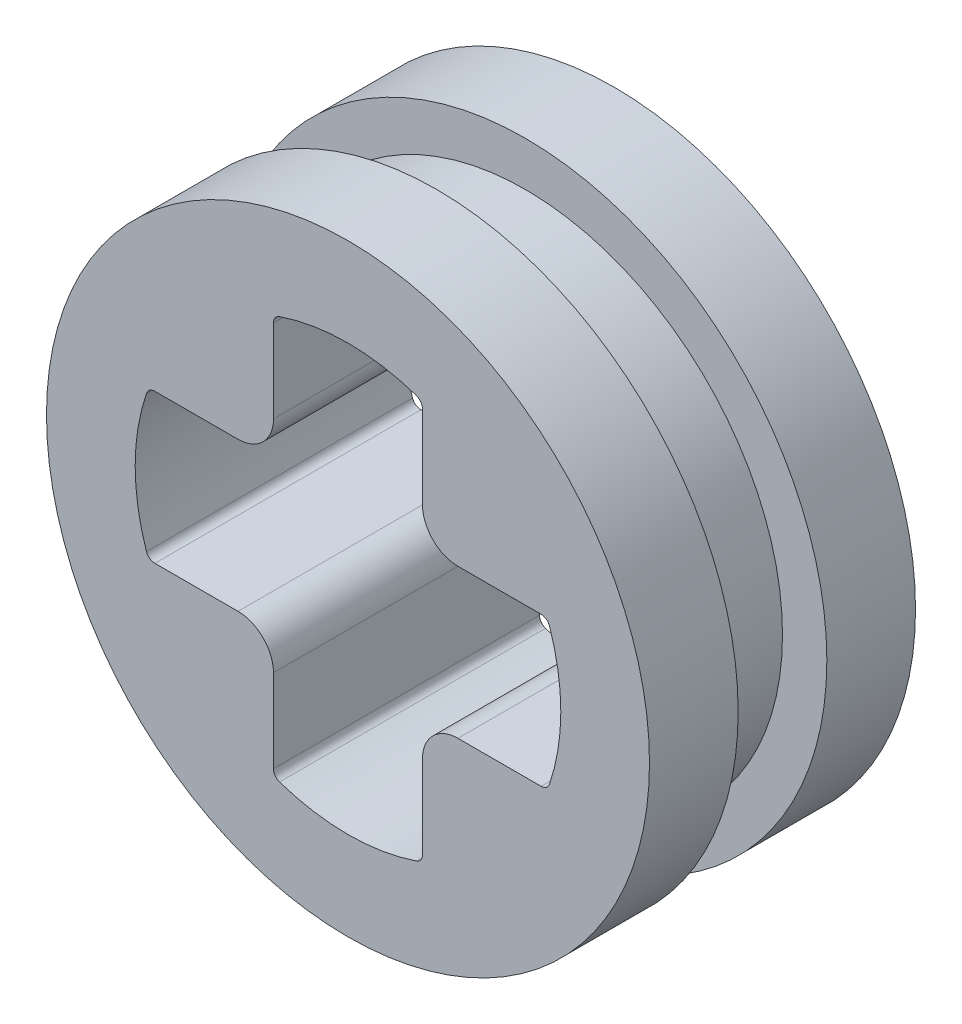
ISO-10303-21;
HEADER;
FILE_DESCRIPTION(('STEP AP214'),'2;1');
FILE_NAME('part.step','',(''),(''),'','','');
FILE_SCHEMA(('AUTOMOTIVE_DESIGN { 1 0 10303 214 1 1 1 1 }'));
ENDSEC;
DATA;
#1=APPLICATION_CONTEXT('core data for automotive mechanical design processes');
#2=APPLICATION_PROTOCOL_DEFINITION('international standard','automotive_design',2000,#1);
#3=PRODUCT_CONTEXT('',#1,'mechanical');
#4=PRODUCT('Part','Part','',(#3));
#5=PRODUCT_RELATED_PRODUCT_CATEGORY('part','',(#4));
#6=PRODUCT_DEFINITION_FORMATION('','',#4);
#7=PRODUCT_DEFINITION_CONTEXT('part definition',#1,'design');
#8=PRODUCT_DEFINITION('design','',#6,#7);
#9=PRODUCT_DEFINITION_SHAPE('','',#8);
#10=(LENGTH_UNIT() NAMED_UNIT(*) SI_UNIT(.MILLI.,.METRE.));
#11=(NAMED_UNIT(*) PLANE_ANGLE_UNIT() SI_UNIT($,.RADIAN.));
#12=(NAMED_UNIT(*) SI_UNIT($,.STERADIAN.) SOLID_ANGLE_UNIT());
#13=UNCERTAINTY_MEASURE_WITH_UNIT(LENGTH_MEASURE(1.E-05),#10,'distance_accuracy_value','');
#14=(GEOMETRIC_REPRESENTATION_CONTEXT(3) GLOBAL_UNCERTAINTY_ASSIGNED_CONTEXT((#13)) GLOBAL_UNIT_ASSIGNED_CONTEXT((#10,
#11,#12)) REPRESENTATION_CONTEXT('',''));
#15=CARTESIAN_POINT('',(0.,0.,0.));
#16=DIRECTION('',(0.,0.,1.));
#17=DIRECTION('',(1.,0.,0.));
#18=AXIS2_PLACEMENT_3D('',#15,#16,#17);
#19=CARTESIAN_POINT('',(0.,0.,1.));
#20=DIRECTION('',(0.,0.,-1.));
#21=DIRECTION('',(-1.,0.,0.));
#22=AXIS2_PLACEMENT_3D('',#19,#20,#21);
#23=CYLINDRICAL_SURFACE('',#22,3.4);
#24=CARTESIAN_POINT('',(0.,0.,1.));
#25=DIRECTION('',(0.,0.,1.));
#26=DIRECTION('',(1.,0.,0.));
#27=AXIS2_PLACEMENT_3D('',#24,#25,#26);
#28=CIRCLE('',#27,3.4);
#29=CARTESIAN_POINT('',(3.4,0.,1.));
#30=VERTEX_POINT('',#29);
#31=EDGE_CURVE('E269',#30,#30,#28,.T.);
#32=ORIENTED_EDGE('',*,*,#31,.F.);
#33=EDGE_LOOP('',(#32));
#34=FACE_BOUND('',#33,.T.);
#35=CARTESIAN_POINT('',(0.,0.,0.));
#36=DIRECTION('',(0.,0.,1.));
#37=DIRECTION('',(1.,0.,0.));
#38=AXIS2_PLACEMENT_3D('',#35,#36,#37);
#39=CIRCLE('',#38,3.4);
#40=CARTESIAN_POINT('',(3.4,0.,0.));
#41=VERTEX_POINT('',#40);
#42=EDGE_CURVE('E266',#41,#41,#39,.T.);
#43=ORIENTED_EDGE('',*,*,#42,.T.);
#44=EDGE_LOOP('',(#43));
#45=FACE_BOUND('',#44,.T.);
#46=ADVANCED_FACE('F38',(#34,#45),#23,.T.);
#47=CARTESIAN_POINT('',(0.,0.,1.));
#48=DIRECTION('',(0.,0.,1.));
#49=DIRECTION('',(1.,0.,0.));
#50=AXIS2_PLACEMENT_3D('',#47,#48,#49);
#51=PLANE('',#50);
#52=CARTESIAN_POINT('',(0.,0.,1.));
#53=DIRECTION('',(0.,0.,1.));
#54=DIRECTION('',(1.,0.,0.));
#55=AXIS2_PLACEMENT_3D('',#52,#53,#54);
#56=CIRCLE('',#55,2.9);
#57=CARTESIAN_POINT('',(2.9,0.,1.));
#58=VERTEX_POINT('',#57);
#59=EDGE_CURVE('E218',#58,#58,#56,.T.);
#60=ORIENTED_EDGE('',*,*,#59,.F.);
#61=EDGE_LOOP('',(#60));
#62=FACE_BOUND('',#61,.T.);
#63=ORIENTED_EDGE('',*,*,#31,.T.);
#64=EDGE_LOOP('',(#63));
#65=FACE_BOUND('',#64,.T.);
#66=ADVANCED_FACE('F446',(#62,#65),#51,.T.);
#67=CARTESIAN_POINT('',(0.,0.,0.));
#68=DIRECTION('',(0.,0.,1.));
#69=DIRECTION('',(1.,0.,0.));
#70=AXIS2_PLACEMENT_3D('',#67,#68,#69);
#71=PLANE('',#70);
#72=DIRECTION('',(-1.,0.,0.));
#73=VECTOR('',#72,1.);
#74=CARTESIAN_POINT('',(-0.84,-0.84,0.));
#75=LINE('',#74,#73);
#76=CARTESIAN_POINT('',(-1.24,-0.84,0.));
#77=VERTEX_POINT('',#76);
#78=CARTESIAN_POINT('',(-2.17770521421059,-0.84,0.));
#79=VERTEX_POINT('',#78);
#80=EDGE_CURVE('E250',#77,#79,#75,.T.);
#81=ORIENTED_EDGE('',*,*,#80,.F.);
#82=CARTESIAN_POINT('',(-1.24,-1.24,0.));
#83=DIRECTION('',(0.,0.,1.));
#84=DIRECTION('',(1.,0.,0.));
#85=AXIS2_PLACEMENT_3D('',#82,#83,#84);
#86=CIRCLE('',#85,0.4);
#87=CARTESIAN_POINT('',(-0.84,-1.24,0.));
#88=VERTEX_POINT('',#87);
#89=EDGE_CURVE('E302',#77,#88,#86,.F.);
#90=ORIENTED_EDGE('',*,*,#89,.T.);
#91=DIRECTION('',(0.,1.,0.));
#92=VECTOR('',#91,1.);
#93=CARTESIAN_POINT('',(-0.84,-0.84,0.));
#94=LINE('',#93,#92);
#95=CARTESIAN_POINT('',(-0.84,-2.17770521421059,0.));
#96=VERTEX_POINT('',#95);
#97=EDGE_CURVE('E248',#96,#88,#94,.T.);
#98=ORIENTED_EDGE('',*,*,#97,.F.);
#99=CARTESIAN_POINT('',(-0.74,-2.17770521421059,0.));
#100=DIRECTION('',(0.,0.,1.));
#101=DIRECTION('',(1.,0.,0.));
#102=AXIS2_PLACEMENT_3D('',#99,#100,#101);
#103=CIRCLE('',#102,0.1);
#104=CARTESIAN_POINT('',(-0.772173913043478,-2.27238804961105,0.));
#105=VERTEX_POINT('',#104);
#106=EDGE_CURVE('E324',#96,#105,#103,.T.);
#107=ORIENTED_EDGE('',*,*,#106,.T.);
#108=CARTESIAN_POINT('',(0.,0.,0.));
#109=DIRECTION('',(0.,0.,-1.));
#110=DIRECTION('',(-1.,0.,0.));
#111=AXIS2_PLACEMENT_3D('',#108,#109,#110);
#112=CIRCLE('',#111,2.4);
#113=CARTESIAN_POINT('',(0.772173913043478,-2.27238804961105,0.));
#114=VERTEX_POINT('',#113);
#115=EDGE_CURVE('E245',#114,#105,#112,.T.);
#116=ORIENTED_EDGE('',*,*,#115,.F.);
#117=CARTESIAN_POINT('',(0.74,-2.17770521421059,0.));
#118=DIRECTION('',(0.,0.,1.));
#119=DIRECTION('',(1.,0.,0.));
#120=AXIS2_PLACEMENT_3D('',#117,#118,#119);
#121=CIRCLE('',#120,0.1);
#122=CARTESIAN_POINT('',(0.84,-2.17770521421059,0.));
#123=VERTEX_POINT('',#122);
#124=EDGE_CURVE('E315',#114,#123,#121,.T.);
#125=ORIENTED_EDGE('',*,*,#124,.T.);
#126=DIRECTION('',(0.,-1.,0.));
#127=VECTOR('',#126,1.);
#128=CARTESIAN_POINT('',(0.84,-0.84,0.));
#129=LINE('',#128,#127);
#130=CARTESIAN_POINT('',(0.84,-1.24,0.));
#131=VERTEX_POINT('',#130);
#132=EDGE_CURVE('E242',#131,#123,#129,.T.);
#133=ORIENTED_EDGE('',*,*,#132,.F.);
#134=CARTESIAN_POINT('',(1.24,-1.24,0.));
#135=DIRECTION('',(0.,0.,1.));
#136=DIRECTION('',(1.,0.,0.));
#137=AXIS2_PLACEMENT_3D('',#134,#135,#136);
#138=CIRCLE('',#137,0.4);
#139=CARTESIAN_POINT('',(1.24,-0.84,0.));
#140=VERTEX_POINT('',#139);
#141=EDGE_CURVE('E291',#131,#140,#138,.F.);
#142=ORIENTED_EDGE('',*,*,#141,.T.);
#143=DIRECTION('',(-1.,0.,0.));
#144=VECTOR('',#143,1.);
#145=CARTESIAN_POINT('',(2.24819927942342,-0.84,0.));
#146=LINE('',#145,#144);
#147=CARTESIAN_POINT('',(2.17770521421059,-0.84,0.));
#148=VERTEX_POINT('',#147);
#149=EDGE_CURVE('E240',#148,#140,#146,.T.);
#150=ORIENTED_EDGE('',*,*,#149,.F.);
#151=CARTESIAN_POINT('',(2.17770521421059,-0.74,0.));
#152=DIRECTION('',(0.,0.,1.));
#153=DIRECTION('',(1.,0.,0.));
#154=AXIS2_PLACEMENT_3D('',#151,#152,#153);
#155=CIRCLE('',#154,0.1);
#156=CARTESIAN_POINT('',(2.27238804961105,-0.772173913043478,0.));
#157=VERTEX_POINT('',#156);
#158=EDGE_CURVE('E46',#148,#157,#155,.T.);
#159=ORIENTED_EDGE('',*,*,#158,.T.);
#160=CARTESIAN_POINT('',(0.,0.,0.));
#161=DIRECTION('',(0.,0.,-1.));
#162=DIRECTION('',(-1.,0.,0.));
#163=AXIS2_PLACEMENT_3D('',#160,#161,#162);
#164=CIRCLE('',#163,2.4);
#165=CARTESIAN_POINT('',(2.27238804961105,0.772173913043478,0.));
#166=VERTEX_POINT('',#165);
#167=EDGE_CURVE('E238',#166,#157,#164,.T.);
#168=ORIENTED_EDGE('',*,*,#167,.F.);
#169=CARTESIAN_POINT('',(2.17770521421059,0.74,0.));
#170=DIRECTION('',(0.,0.,1.));
#171=DIRECTION('',(1.,0.,0.));
#172=AXIS2_PLACEMENT_3D('',#169,#170,#171);
#173=CIRCLE('',#172,0.1);
#174=CARTESIAN_POINT('',(2.17770521421059,0.84,0.));
#175=VERTEX_POINT('',#174);
#176=EDGE_CURVE('E370',#166,#175,#173,.T.);
#177=ORIENTED_EDGE('',*,*,#176,.T.);
#178=DIRECTION('',(1.,0.,0.));
#179=VECTOR('',#178,1.);
#180=CARTESIAN_POINT('',(2.24819927942342,0.84,0.));
#181=LINE('',#180,#179);
#182=CARTESIAN_POINT('',(1.24,0.84,0.));
#183=VERTEX_POINT('',#182);
#184=EDGE_CURVE('E235',#183,#175,#181,.T.);
#185=ORIENTED_EDGE('',*,*,#184,.F.);
#186=CARTESIAN_POINT('',(1.24,1.24,0.));
#187=DIRECTION('',(0.,0.,1.));
#188=DIRECTION('',(1.,0.,0.));
#189=AXIS2_PLACEMENT_3D('',#186,#187,#188);
#190=CIRCLE('',#189,0.4);
#191=CARTESIAN_POINT('',(0.84,1.24,0.));
#192=VERTEX_POINT('',#191);
#193=EDGE_CURVE('E280',#183,#192,#190,.F.);
#194=ORIENTED_EDGE('',*,*,#193,.T.);
#195=DIRECTION('',(0.,-1.,0.));
#196=VECTOR('',#195,1.);
#197=CARTESIAN_POINT('',(0.84,2.24819927942342,0.));
#198=LINE('',#197,#196);
#199=CARTESIAN_POINT('',(0.84,2.17770521421059,0.));
#200=VERTEX_POINT('',#199);
#201=EDGE_CURVE('E229',#200,#192,#198,.T.);
#202=ORIENTED_EDGE('',*,*,#201,.F.);
#203=CARTESIAN_POINT('',(0.74,2.17770521421059,0.));
#204=DIRECTION('',(0.,0.,1.));
#205=DIRECTION('',(1.,0.,0.));
#206=AXIS2_PLACEMENT_3D('',#203,#204,#205);
#207=CIRCLE('',#206,0.1);
#208=CARTESIAN_POINT('',(0.772173913043478,2.27238804961105,0.));
#209=VERTEX_POINT('',#208);
#210=EDGE_CURVE('E361',#200,#209,#207,.T.);
#211=ORIENTED_EDGE('',*,*,#210,.T.);
#212=CARTESIAN_POINT('',(0.,0.,0.));
#213=DIRECTION('',(0.,0.,-1.));
#214=DIRECTION('',(-1.,0.,0.));
#215=AXIS2_PLACEMENT_3D('',#212,#213,#214);
#216=CIRCLE('',#215,2.4);
#217=CARTESIAN_POINT('',(-0.772173913043478,2.27238804961105,0.));
#218=VERTEX_POINT('',#217);
#219=EDGE_CURVE('E225',#218,#209,#216,.T.);
#220=ORIENTED_EDGE('',*,*,#219,.F.);
#221=CARTESIAN_POINT('',(-0.74,2.17770521421059,0.));
#222=DIRECTION('',(0.,0.,1.));
#223=DIRECTION('',(1.,0.,0.));
#224=AXIS2_PLACEMENT_3D('',#221,#222,#223);
#225=CIRCLE('',#224,0.1);
#226=CARTESIAN_POINT('',(-0.84,2.17770521421059,0.));
#227=VERTEX_POINT('',#226);
#228=EDGE_CURVE('E224',#218,#227,#225,.T.);
#229=ORIENTED_EDGE('',*,*,#228,.T.);
#230=DIRECTION('',(0.,1.,0.));
#231=VECTOR('',#230,1.);
#232=CARTESIAN_POINT('',(-0.84,2.24819927942342,0.));
#233=LINE('',#232,#231);
#234=CARTESIAN_POINT('',(-0.84,1.24,0.));
#235=VERTEX_POINT('',#234);
#236=EDGE_CURVE('E214',#235,#227,#233,.T.);
#237=ORIENTED_EDGE('',*,*,#236,.F.);
#238=CARTESIAN_POINT('',(-1.24,1.24,0.));
#239=DIRECTION('',(0.,0.,1.));
#240=DIRECTION('',(1.,0.,0.));
#241=AXIS2_PLACEMENT_3D('',#238,#239,#240);
#242=CIRCLE('',#241,0.4);
#243=CARTESIAN_POINT('',(-1.24,0.84,0.));
#244=VERTEX_POINT('',#243);
#245=EDGE_CURVE('E200',#235,#244,#242,.F.);
#246=ORIENTED_EDGE('',*,*,#245,.T.);
#247=DIRECTION('',(1.,0.,0.));
#248=VECTOR('',#247,1.);
#249=CARTESIAN_POINT('',(-0.84,0.84,0.));
#250=LINE('',#249,#248);
#251=CARTESIAN_POINT('',(-2.17770521421059,0.84,0.));
#252=VERTEX_POINT('',#251);
#253=EDGE_CURVE('E226',#252,#244,#250,.T.);
#254=ORIENTED_EDGE('',*,*,#253,.F.);
#255=CARTESIAN_POINT('',(-2.17770521421059,0.74,0.));
#256=DIRECTION('',(0.,0.,1.));
#257=DIRECTION('',(1.,0.,0.));
#258=AXIS2_PLACEMENT_3D('',#255,#256,#257);
#259=CIRCLE('',#258,0.1);
#260=CARTESIAN_POINT('',(-2.27238804961105,0.772173913043478,0.));
#261=VERTEX_POINT('',#260);
#262=EDGE_CURVE('E334',#252,#261,#259,.T.);
#263=ORIENTED_EDGE('',*,*,#262,.T.);
#264=CARTESIAN_POINT('',(0.,0.,0.));
#265=DIRECTION('',(0.,0.,-1.));
#266=DIRECTION('',(-1.,0.,0.));
#267=AXIS2_PLACEMENT_3D('',#264,#265,#266);
#268=CIRCLE('',#267,2.4);
#269=CARTESIAN_POINT('',(-2.27238804961105,-0.772173913043478,0.));
#270=VERTEX_POINT('',#269);
#271=EDGE_CURVE('E253',#270,#261,#268,.T.);
#272=ORIENTED_EDGE('',*,*,#271,.F.);
#273=CARTESIAN_POINT('',(-2.17770521421059,-0.74,0.));
#274=DIRECTION('',(0.,0.,1.));
#275=DIRECTION('',(1.,0.,0.));
#276=AXIS2_PLACEMENT_3D('',#273,#274,#275);
#277=CIRCLE('',#276,0.1);
#278=EDGE_CURVE('E344',#270,#79,#277,.T.);
#279=ORIENTED_EDGE('',*,*,#278,.T.);
#280=EDGE_LOOP('',(#81,#90,#98,#107,#116,#125,#133,#142,#150,#159,#168,#177,#185,#194,#202,#211,
#220,#229,#237,#246,#254,#263,#272,#279));
#281=FACE_BOUND('',#280,.T.);
#282=ORIENTED_EDGE('',*,*,#42,.F.);
#283=EDGE_LOOP('',(#282));
#284=FACE_BOUND('',#283,.T.);
#285=ADVANCED_FACE('F221',(#281,#284),#71,.F.);
#286=CARTESIAN_POINT('',(0.,0.,2.));
#287=DIRECTION('',(0.,0.,-1.));
#288=DIRECTION('',(-1.,0.,0.));
#289=AXIS2_PLACEMENT_3D('',#286,#287,#288);
#290=CYLINDRICAL_SURFACE('',#289,2.9);
#291=CARTESIAN_POINT('',(0.,0.,2.));
#292=DIRECTION('',(0.,0.,1.));
#293=DIRECTION('',(1.,0.,0.));
#294=AXIS2_PLACEMENT_3D('',#291,#292,#293);
#295=CIRCLE('',#294,2.9);
#296=CARTESIAN_POINT('',(2.9,0.,2.));
#297=VERTEX_POINT('',#296);
#298=EDGE_CURVE('E259',#297,#297,#295,.T.);
#299=ORIENTED_EDGE('',*,*,#298,.F.);
#300=EDGE_LOOP('',(#299));
#301=FACE_BOUND('',#300,.T.);
#302=ORIENTED_EDGE('',*,*,#59,.T.);
#303=EDGE_LOOP('',(#302));
#304=FACE_BOUND('',#303,.T.);
#305=ADVANCED_FACE('F532',(#301,#304),#290,.T.);
#306=CARTESIAN_POINT('',(0.,0.,2.));
#307=DIRECTION('',(0.,0.,1.));
#308=DIRECTION('',(1.,0.,0.));
#309=AXIS2_PLACEMENT_3D('',#306,#307,#308);
#310=CYLINDRICAL_SURFACE('',#309,3.4);
#311=CARTESIAN_POINT('',(0.,0.,2.));
#312=DIRECTION('',(0.,0.,1.));
#313=DIRECTION('',(1.,0.,0.));
#314=AXIS2_PLACEMENT_3D('',#311,#312,#313);
#315=CIRCLE('',#314,3.4);
#316=CARTESIAN_POINT('',(3.4,0.,2.));
#317=VERTEX_POINT('',#316);
#318=EDGE_CURVE('E256',#317,#317,#315,.T.);
#319=ORIENTED_EDGE('',*,*,#318,.T.);
#320=EDGE_LOOP('',(#319));
#321=FACE_BOUND('',#320,.T.);
#322=CARTESIAN_POINT('',(0.,0.,3.));
#323=DIRECTION('',(0.,0.,1.));
#324=DIRECTION('',(1.,0.,0.));
#325=AXIS2_PLACEMENT_3D('',#322,#323,#324);
#326=CIRCLE('',#325,3.4);
#327=CARTESIAN_POINT('',(3.4,0.,3.));
#328=VERTEX_POINT('',#327);
#329=EDGE_CURVE('E260',#328,#328,#326,.T.);
#330=ORIENTED_EDGE('',*,*,#329,.F.);
#331=EDGE_LOOP('',(#330));
#332=FACE_BOUND('',#331,.T.);
#333=ADVANCED_FACE('F526',(#321,#332),#310,.T.);
#334=CARTESIAN_POINT('',(0.,0.,2.));
#335=DIRECTION('',(0.,0.,-1.));
#336=DIRECTION('',(1.,0.,0.));
#337=AXIS2_PLACEMENT_3D('',#334,#335,#336);
#338=PLANE('',#337);
#339=ORIENTED_EDGE('',*,*,#298,.T.);
#340=EDGE_LOOP('',(#339));
#341=FACE_BOUND('',#340,.T.);
#342=ORIENTED_EDGE('',*,*,#318,.F.);
#343=EDGE_LOOP('',(#342));
#344=FACE_BOUND('',#343,.T.);
#345=ADVANCED_FACE('F523',(#341,#344),#338,.T.);
#346=CARTESIAN_POINT('',(0.,0.,3.));
#347=DIRECTION('',(0.,0.,-1.));
#348=DIRECTION('',(1.,0.,0.));
#349=AXIS2_PLACEMENT_3D('',#346,#347,#348);
#350=PLANE('',#349);
#351=CARTESIAN_POINT('',(0.,0.,3.));
#352=DIRECTION('',(0.,0.,-1.));
#353=DIRECTION('',(-1.,0.,0.));
#354=AXIS2_PLACEMENT_3D('',#351,#352,#353);
#355=CIRCLE('',#354,2.4);
#356=CARTESIAN_POINT('',(0.772173913043478,-2.27238804961105,3.));
#357=VERTEX_POINT('',#356);
#358=CARTESIAN_POINT('',(-0.772173913043478,-2.27238804961105,3.));
#359=VERTEX_POINT('',#358);
#360=EDGE_CURVE('E401',#357,#359,#355,.T.);
#361=ORIENTED_EDGE('',*,*,#360,.T.);
#362=CARTESIAN_POINT('',(-0.74,-2.17770521421059,3.));
#363=DIRECTION('',(0.,0.,-1.));
#364=DIRECTION('',(-1.,0.,0.));
#365=AXIS2_PLACEMENT_3D('',#362,#363,#364);
#366=CIRCLE('',#365,0.1);
#367=CARTESIAN_POINT('',(-0.84,-2.17770521421059,3.));
#368=VERTEX_POINT('',#367);
#369=EDGE_CURVE('E326',#359,#368,#366,.T.);
#370=ORIENTED_EDGE('',*,*,#369,.T.);
#371=DIRECTION('',(0.,1.,0.));
#372=VECTOR('',#371,1.);
#373=CARTESIAN_POINT('',(-0.84,-0.84,3.));
#374=LINE('',#373,#372);
#375=CARTESIAN_POINT('',(-0.84,-1.24,3.));
#376=VERTEX_POINT('',#375);
#377=EDGE_CURVE('E403',#368,#376,#374,.T.);
#378=ORIENTED_EDGE('',*,*,#377,.T.);
#379=CARTESIAN_POINT('',(-1.24,-1.24,3.));
#380=DIRECTION('',(0.,0.,-1.));
#381=DIRECTION('',(-1.,0.,0.));
#382=AXIS2_PLACEMENT_3D('',#379,#380,#381);
#383=CIRCLE('',#382,0.4);
#384=CARTESIAN_POINT('',(-1.24,-0.84,3.));
#385=VERTEX_POINT('',#384);
#386=EDGE_CURVE('E308',#376,#385,#383,.F.);
#387=ORIENTED_EDGE('',*,*,#386,.T.);
#388=DIRECTION('',(-1.,0.,0.));
#389=VECTOR('',#388,1.);
#390=CARTESIAN_POINT('',(-0.84,-0.84,3.));
#391=LINE('',#390,#389);
#392=CARTESIAN_POINT('',(-2.17770521421059,-0.84,3.));
#393=VERTEX_POINT('',#392);
#394=EDGE_CURVE('E410',#385,#393,#391,.T.);
#395=ORIENTED_EDGE('',*,*,#394,.T.);
#396=CARTESIAN_POINT('',(-2.17770521421059,-0.74,3.));
#397=DIRECTION('',(0.,0.,-1.));
#398=DIRECTION('',(-1.,0.,0.));
#399=AXIS2_PLACEMENT_3D('',#396,#397,#398);
#400=CIRCLE('',#399,0.1);
#401=CARTESIAN_POINT('',(-2.27238804961105,-0.772173913043478,3.));
#402=VERTEX_POINT('',#401);
#403=EDGE_CURVE('E346',#393,#402,#400,.T.);
#404=ORIENTED_EDGE('',*,*,#403,.T.);
#405=CARTESIAN_POINT('',(0.,0.,3.));
#406=DIRECTION('',(0.,0.,-1.));
#407=DIRECTION('',(-1.,0.,0.));
#408=AXIS2_PLACEMENT_3D('',#405,#406,#407);
#409=CIRCLE('',#408,2.4);
#410=CARTESIAN_POINT('',(-2.27238804961105,0.772173913043478,3.));
#411=VERTEX_POINT('',#410);
#412=EDGE_CURVE('E263',#402,#411,#409,.T.);
#413=ORIENTED_EDGE('',*,*,#412,.T.);
#414=CARTESIAN_POINT('',(-2.17770521421059,0.74,3.));
#415=DIRECTION('',(0.,0.,-1.));
#416=DIRECTION('',(-1.,0.,0.));
#417=AXIS2_PLACEMENT_3D('',#414,#415,#416);
#418=CIRCLE('',#417,0.1);
#419=CARTESIAN_POINT('',(-2.17770521421059,0.84,3.));
#420=VERTEX_POINT('',#419);
#421=EDGE_CURVE('E337',#411,#420,#418,.T.);
#422=ORIENTED_EDGE('',*,*,#421,.T.);
#423=DIRECTION('',(1.,0.,0.));
#424=VECTOR('',#423,1.);
#425=CARTESIAN_POINT('',(-0.84,0.84,3.));
#426=LINE('',#425,#424);
#427=CARTESIAN_POINT('',(-1.24,0.84,3.));
#428=VERTEX_POINT('',#427);
#429=EDGE_CURVE('E255',#420,#428,#426,.T.);
#430=ORIENTED_EDGE('',*,*,#429,.T.);
#431=CARTESIAN_POINT('',(-1.24,1.24,3.));
#432=DIRECTION('',(0.,0.,-1.));
#433=DIRECTION('',(-1.,0.,0.));
#434=AXIS2_PLACEMENT_3D('',#431,#432,#433);
#435=CIRCLE('',#434,0.4);
#436=CARTESIAN_POINT('',(-0.84,1.24,3.));
#437=VERTEX_POINT('',#436);
#438=EDGE_CURVE('E275',#428,#437,#435,.F.);
#439=ORIENTED_EDGE('',*,*,#438,.T.);
#440=DIRECTION('',(0.,1.,0.));
#441=VECTOR('',#440,1.);
#442=CARTESIAN_POINT('',(-0.84,2.24819927942342,3.));
#443=LINE('',#442,#441);
#444=CARTESIAN_POINT('',(-0.84,2.17770521421059,3.));
#445=VERTEX_POINT('',#444);
#446=EDGE_CURVE('E217',#437,#445,#443,.T.);
#447=ORIENTED_EDGE('',*,*,#446,.T.);
#448=CARTESIAN_POINT('',(-0.74,2.17770521421059,3.));
#449=DIRECTION('',(0.,0.,-1.));
#450=DIRECTION('',(-1.,0.,0.));
#451=AXIS2_PLACEMENT_3D('',#448,#449,#450);
#452=CIRCLE('',#451,0.1);
#453=CARTESIAN_POINT('',(-0.772173913043478,2.27238804961105,3.));
#454=VERTEX_POINT('',#453);
#455=EDGE_CURVE('E354',#445,#454,#452,.T.);
#456=ORIENTED_EDGE('',*,*,#455,.T.);
#457=CARTESIAN_POINT('',(0.,0.,3.));
#458=DIRECTION('',(0.,0.,-1.));
#459=DIRECTION('',(-1.,0.,0.));
#460=AXIS2_PLACEMENT_3D('',#457,#458,#459);
#461=CIRCLE('',#460,2.4);
#462=CARTESIAN_POINT('',(0.772173913043478,2.27238804961105,3.));
#463=VERTEX_POINT('',#462);
#464=EDGE_CURVE('E737',#454,#463,#461,.T.);
#465=ORIENTED_EDGE('',*,*,#464,.T.);
#466=CARTESIAN_POINT('',(0.74,2.17770521421059,3.));
#467=DIRECTION('',(0.,0.,-1.));
#468=DIRECTION('',(-1.,0.,0.));
#469=AXIS2_PLACEMENT_3D('',#466,#467,#468);
#470=CIRCLE('',#469,0.1);
#471=CARTESIAN_POINT('',(0.84,2.17770521421059,3.));
#472=VERTEX_POINT('',#471);
#473=EDGE_CURVE('E363',#463,#472,#470,.T.);
#474=ORIENTED_EDGE('',*,*,#473,.T.);
#475=DIRECTION('',(0.,-1.,0.));
#476=VECTOR('',#475,1.);
#477=CARTESIAN_POINT('',(0.84,2.24819927942342,3.));
#478=LINE('',#477,#476);
#479=CARTESIAN_POINT('',(0.84,1.24,3.));
#480=VERTEX_POINT('',#479);
#481=EDGE_CURVE('E733',#472,#480,#478,.T.);
#482=ORIENTED_EDGE('',*,*,#481,.T.);
#483=CARTESIAN_POINT('',(1.24,1.24,3.));
#484=DIRECTION('',(0.,0.,-1.));
#485=DIRECTION('',(-1.,0.,0.));
#486=AXIS2_PLACEMENT_3D('',#483,#484,#485);
#487=CIRCLE('',#486,0.4);
#488=CARTESIAN_POINT('',(1.24,0.84,3.));
#489=VERTEX_POINT('',#488);
#490=EDGE_CURVE('E286',#480,#489,#487,.F.);
#491=ORIENTED_EDGE('',*,*,#490,.T.);
#492=DIRECTION('',(1.,0.,0.));
#493=VECTOR('',#492,1.);
#494=CARTESIAN_POINT('',(2.24819927942342,0.84,3.));
#495=LINE('',#494,#493);
#496=CARTESIAN_POINT('',(2.17770521421059,0.84,3.));
#497=VERTEX_POINT('',#496);
#498=EDGE_CURVE('E732',#489,#497,#495,.T.);
#499=ORIENTED_EDGE('',*,*,#498,.T.);
#500=CARTESIAN_POINT('',(2.17770521421059,0.74,3.));
#501=DIRECTION('',(0.,0.,-1.));
#502=DIRECTION('',(-1.,0.,0.));
#503=AXIS2_PLACEMENT_3D('',#500,#501,#502);
#504=CIRCLE('',#503,0.1);
#505=CARTESIAN_POINT('',(2.27238804961105,0.772173913043478,3.));
#506=VERTEX_POINT('',#505);
#507=EDGE_CURVE('E372',#497,#506,#504,.T.);
#508=ORIENTED_EDGE('',*,*,#507,.T.);
#509=CARTESIAN_POINT('',(0.,0.,3.));
#510=DIRECTION('',(0.,0.,-1.));
#511=DIRECTION('',(-1.,0.,0.));
#512=AXIS2_PLACEMENT_3D('',#509,#510,#511);
#513=CIRCLE('',#512,2.4);
#514=CARTESIAN_POINT('',(2.27238804961105,-0.772173913043478,3.));
#515=VERTEX_POINT('',#514);
#516=EDGE_CURVE('E405',#506,#515,#513,.T.);
#517=ORIENTED_EDGE('',*,*,#516,.T.);
#518=CARTESIAN_POINT('',(2.17770521421059,-0.74,3.));
#519=DIRECTION('',(0.,0.,-1.));
#520=DIRECTION('',(-1.,0.,0.));
#521=AXIS2_PLACEMENT_3D('',#518,#519,#520);
#522=CIRCLE('',#521,0.1);
#523=CARTESIAN_POINT('',(2.17770521421059,-0.84,3.));
#524=VERTEX_POINT('',#523);
#525=EDGE_CURVE('E11',#515,#524,#522,.T.);
#526=ORIENTED_EDGE('',*,*,#525,.T.);
#527=DIRECTION('',(-1.,0.,0.));
#528=VECTOR('',#527,1.);
#529=CARTESIAN_POINT('',(2.24819927942342,-0.84,3.));
#530=LINE('',#529,#528);
#531=CARTESIAN_POINT('',(1.24,-0.84,3.));
#532=VERTEX_POINT('',#531);
#533=EDGE_CURVE('E381',#524,#532,#530,.T.);
#534=ORIENTED_EDGE('',*,*,#533,.T.);
#535=CARTESIAN_POINT('',(1.24,-1.24,3.));
#536=DIRECTION('',(0.,0.,-1.));
#537=DIRECTION('',(-1.,0.,0.));
#538=AXIS2_PLACEMENT_3D('',#535,#536,#537);
#539=CIRCLE('',#538,0.4);
#540=CARTESIAN_POINT('',(0.84,-1.24,3.));
#541=VERTEX_POINT('',#540);
#542=EDGE_CURVE('E297',#532,#541,#539,.F.);
#543=ORIENTED_EDGE('',*,*,#542,.T.);
#544=DIRECTION('',(0.,-1.,0.));
#545=VECTOR('',#544,1.);
#546=CARTESIAN_POINT('',(0.84,-0.84,3.));
#547=LINE('',#546,#545);
#548=CARTESIAN_POINT('',(0.84,-2.17770521421059,3.));
#549=VERTEX_POINT('',#548);
#550=EDGE_CURVE('E396',#541,#549,#547,.T.);
#551=ORIENTED_EDGE('',*,*,#550,.T.);
#552=CARTESIAN_POINT('',(0.74,-2.17770521421059,3.));
#553=DIRECTION('',(0.,0.,-1.));
#554=DIRECTION('',(-1.,0.,0.));
#555=AXIS2_PLACEMENT_3D('',#552,#553,#554);
#556=CIRCLE('',#555,0.1);
#557=EDGE_CURVE('E317',#549,#357,#556,.T.);
#558=ORIENTED_EDGE('',*,*,#557,.T.);
#559=EDGE_LOOP('',(#361,#370,#378,#387,#395,#404,#413,#422,#430,#439,#447,#456,#465,#474,#482,
#491,#499,#508,#517,#526,#534,#543,#551,#558));
#560=FACE_BOUND('',#559,.T.);
#561=ORIENTED_EDGE('',*,*,#329,.T.);
#562=EDGE_LOOP('',(#561));
#563=FACE_BOUND('',#562,.T.);
#564=ADVANCED_FACE('F394',(#560,#563),#350,.F.);
#565=CARTESIAN_POINT('',(-0.84,0.84,3.));
#566=DIRECTION('',(0.,1.,0.));
#567=DIRECTION('',(-1.,0.,0.));
#568=AXIS2_PLACEMENT_3D('',#565,#566,#567);
#569=PLANE('',#568);
#570=ORIENTED_EDGE('',*,*,#429,.F.);
#571=DIRECTION('',(0.,0.,1.));
#572=VECTOR('',#571,1.);
#573=CARTESIAN_POINT('',(-2.17770521421059,0.84,0.));
#574=LINE('',#573,#572);
#575=EDGE_CURVE('E328',#420,#252,#574,.F.);
#576=ORIENTED_EDGE('',*,*,#575,.T.);
#577=ORIENTED_EDGE('',*,*,#253,.T.);
#578=DIRECTION('',(0.,0.,-1.));
#579=VECTOR('',#578,1.);
#580=CARTESIAN_POINT('',(-1.24,0.84,3.));
#581=LINE('',#580,#579);
#582=EDGE_CURVE('E206',#244,#428,#581,.F.);
#583=ORIENTED_EDGE('',*,*,#582,.T.);
#584=EDGE_LOOP('',(#570,#576,#577,#583));
#585=FACE_BOUND('',#584,.T.);
#586=ADVANCED_FACE('F425',(#585),#569,.F.);
#587=CARTESIAN_POINT('',(0.,0.,3.));
#588=DIRECTION('',(0.,0.,-1.));
#589=DIRECTION('',(-1.,0.,0.));
#590=AXIS2_PLACEMENT_3D('',#587,#588,#589);
#591=CYLINDRICAL_SURFACE('',#590,2.4);
#592=ORIENTED_EDGE('',*,*,#412,.F.);
#593=DIRECTION('',(0.,0.,-1.));
#594=VECTOR('',#593,1.);
#595=CARTESIAN_POINT('',(-2.27238804961105,-0.772173913043478,3.));
#596=LINE('',#595,#594);
#597=EDGE_CURVE('E339',#402,#270,#596,.T.);
#598=ORIENTED_EDGE('',*,*,#597,.T.);
#599=ORIENTED_EDGE('',*,*,#271,.T.);
#600=DIRECTION('',(0.,0.,-1.));
#601=VECTOR('',#600,1.);
#602=CARTESIAN_POINT('',(-2.27238804961105,0.772173913043478,3.));
#603=LINE('',#602,#601);
#604=EDGE_CURVE('E331',#261,#411,#603,.F.);
#605=ORIENTED_EDGE('',*,*,#604,.T.);
#606=EDGE_LOOP('',(#592,#598,#599,#605));
#607=FACE_BOUND('',#606,.T.);
#608=ADVANCED_FACE('F419',(#607),#591,.F.);
#609=CARTESIAN_POINT('',(-0.84,-0.84,3.));
#610=DIRECTION('',(0.,-1.,0.));
#611=DIRECTION('',(0.,0.,-1.));
#612=AXIS2_PLACEMENT_3D('',#609,#610,#611);
#613=PLANE('',#612);
#614=ORIENTED_EDGE('',*,*,#80,.T.);
#615=DIRECTION('',(0.,0.,1.));
#616=VECTOR('',#615,1.);
#617=CARTESIAN_POINT('',(-2.17770521421059,-0.84,3.));
#618=LINE('',#617,#616);
#619=EDGE_CURVE('E342',#79,#393,#618,.T.);
#620=ORIENTED_EDGE('',*,*,#619,.T.);
#621=ORIENTED_EDGE('',*,*,#394,.F.);
#622=DIRECTION('',(0.,0.,-1.));
#623=VECTOR('',#622,1.);
#624=CARTESIAN_POINT('',(-1.24,-0.84,3.));
#625=LINE('',#624,#623);
#626=EDGE_CURVE('E299',#385,#77,#625,.T.);
#627=ORIENTED_EDGE('',*,*,#626,.T.);
#628=EDGE_LOOP('',(#614,#620,#621,#627));
#629=FACE_BOUND('',#628,.T.);
#630=ADVANCED_FACE('F429',(#629),#613,.F.);
#631=CARTESIAN_POINT('',(-0.84,-0.84,3.));
#632=DIRECTION('',(-1.,0.,0.));
#633=DIRECTION('',(0.,0.,1.));
#634=AXIS2_PLACEMENT_3D('',#631,#632,#633);
#635=PLANE('',#634);
#636=ORIENTED_EDGE('',*,*,#377,.F.);
#637=DIRECTION('',(0.,0.,1.));
#638=VECTOR('',#637,1.);
#639=CARTESIAN_POINT('',(-0.84,-2.17770521421059,0.));
#640=LINE('',#639,#638);
#641=EDGE_CURVE('E319',#368,#96,#640,.F.);
#642=ORIENTED_EDGE('',*,*,#641,.T.);
#643=ORIENTED_EDGE('',*,*,#97,.T.);
#644=DIRECTION('',(0.,0.,-1.));
#645=VECTOR('',#644,1.);
#646=CARTESIAN_POINT('',(-0.84,-1.24,3.));
#647=LINE('',#646,#645);
#648=EDGE_CURVE('E305',#88,#376,#647,.F.);
#649=ORIENTED_EDGE('',*,*,#648,.T.);
#650=EDGE_LOOP('',(#636,#642,#643,#649));
#651=FACE_BOUND('',#650,.T.);
#652=ADVANCED_FACE('F484',(#651),#635,.F.);
#653=CARTESIAN_POINT('',(0.,0.,3.));
#654=DIRECTION('',(0.,0.,-1.));
#655=DIRECTION('',(-1.,0.,0.));
#656=AXIS2_PLACEMENT_3D('',#653,#654,#655);
#657=CYLINDRICAL_SURFACE('',#656,2.4);
#658=ORIENTED_EDGE('',*,*,#115,.T.);
#659=DIRECTION('',(0.,0.,-1.));
#660=VECTOR('',#659,1.);
#661=CARTESIAN_POINT('',(-0.772173913043478,-2.27238804961105,3.));
#662=LINE('',#661,#660);
#663=EDGE_CURVE('E322',#105,#359,#662,.F.);
#664=ORIENTED_EDGE('',*,*,#663,.T.);
#665=ORIENTED_EDGE('',*,*,#360,.F.);
#666=DIRECTION('',(0.,0.,-1.));
#667=VECTOR('',#666,1.);
#668=CARTESIAN_POINT('',(0.772173913043478,-2.27238804961105,3.));
#669=LINE('',#668,#667);
#670=EDGE_CURVE('E310',#357,#114,#669,.T.);
#671=ORIENTED_EDGE('',*,*,#670,.T.);
#672=EDGE_LOOP('',(#658,#664,#665,#671));
#673=FACE_BOUND('',#672,.T.);
#674=ADVANCED_FACE('F490',(#673),#657,.F.);
#675=CARTESIAN_POINT('',(0.84,-0.84,3.));
#676=DIRECTION('',(1.,0.,0.));
#677=DIRECTION('',(0.,0.,-1.));
#678=AXIS2_PLACEMENT_3D('',#675,#676,#677);
#679=PLANE('',#678);
#680=ORIENTED_EDGE('',*,*,#132,.T.);
#681=DIRECTION('',(0.,0.,1.));
#682=VECTOR('',#681,1.);
#683=CARTESIAN_POINT('',(0.84,-2.17770521421059,3.));
#684=LINE('',#683,#682);
#685=EDGE_CURVE('E313',#123,#549,#684,.T.);
#686=ORIENTED_EDGE('',*,*,#685,.T.);
#687=ORIENTED_EDGE('',*,*,#550,.F.);
#688=DIRECTION('',(0.,0.,-1.));
#689=VECTOR('',#688,1.);
#690=CARTESIAN_POINT('',(0.84,-1.24,3.));
#691=LINE('',#690,#689);
#692=EDGE_CURVE('E288',#541,#131,#691,.T.);
#693=ORIENTED_EDGE('',*,*,#692,.T.);
#694=EDGE_LOOP('',(#680,#686,#687,#693));
#695=FACE_BOUND('',#694,.T.);
#696=ADVANCED_FACE('F399',(#695),#679,.F.);
#697=CARTESIAN_POINT('',(2.24819927942342,-0.84,3.));
#698=DIRECTION('',(0.,-1.,0.));
#699=DIRECTION('',(1.,0.,0.));
#700=AXIS2_PLACEMENT_3D('',#697,#698,#699);
#701=PLANE('',#700);
#702=ORIENTED_EDGE('',*,*,#533,.F.);
#703=DIRECTION('',(0.,0.,1.));
#704=VECTOR('',#703,1.);
#705=CARTESIAN_POINT('',(2.17770521421059,-0.84,0.));
#706=LINE('',#705,#704);
#707=EDGE_CURVE('E374',#524,#148,#706,.F.);
#708=ORIENTED_EDGE('',*,*,#707,.T.);
#709=ORIENTED_EDGE('',*,*,#149,.T.);
#710=DIRECTION('',(0.,0.,-1.));
#711=VECTOR('',#710,1.);
#712=CARTESIAN_POINT('',(1.24,-0.84,3.));
#713=LINE('',#712,#711);
#714=EDGE_CURVE('E294',#140,#532,#713,.F.);
#715=ORIENTED_EDGE('',*,*,#714,.T.);
#716=EDGE_LOOP('',(#702,#708,#709,#715));
#717=FACE_BOUND('',#716,.T.);
#718=ADVANCED_FACE('F380',(#717),#701,.F.);
#719=CARTESIAN_POINT('',(0.,0.,3.));
#720=DIRECTION('',(0.,0.,-1.));
#721=DIRECTION('',(-1.,0.,0.));
#722=AXIS2_PLACEMENT_3D('',#719,#720,#721);
#723=CYLINDRICAL_SURFACE('',#722,2.4);
#724=ORIENTED_EDGE('',*,*,#167,.T.);
#725=DIRECTION('',(0.,0.,-1.));
#726=VECTOR('',#725,1.);
#727=CARTESIAN_POINT('',(2.27238804961105,-0.772173913043478,3.));
#728=LINE('',#727,#726);
#729=EDGE_CURVE('E59',#157,#515,#728,.F.);
#730=ORIENTED_EDGE('',*,*,#729,.T.);
#731=ORIENTED_EDGE('',*,*,#516,.F.);
#732=DIRECTION('',(0.,0.,-1.));
#733=VECTOR('',#732,1.);
#734=CARTESIAN_POINT('',(2.27238804961105,0.772173913043478,3.));
#735=LINE('',#734,#733);
#736=EDGE_CURVE('E365',#506,#166,#735,.T.);
#737=ORIENTED_EDGE('',*,*,#736,.T.);
#738=EDGE_LOOP('',(#724,#730,#731,#737));
#739=FACE_BOUND('',#738,.T.);
#740=ADVANCED_FACE('F504',(#739),#723,.F.);
#741=CARTESIAN_POINT('',(2.24819927942342,0.84,3.));
#742=DIRECTION('',(0.,1.,0.));
#743=DIRECTION('',(-1.,0.,0.));
#744=AXIS2_PLACEMENT_3D('',#741,#742,#743);
#745=PLANE('',#744);
#746=ORIENTED_EDGE('',*,*,#184,.T.);
#747=DIRECTION('',(0.,0.,1.));
#748=VECTOR('',#747,1.);
#749=CARTESIAN_POINT('',(2.17770521421059,0.84,3.));
#750=LINE('',#749,#748);
#751=EDGE_CURVE('E368',#175,#497,#750,.T.);
#752=ORIENTED_EDGE('',*,*,#751,.T.);
#753=ORIENTED_EDGE('',*,*,#498,.F.);
#754=DIRECTION('',(0.,0.,-1.));
#755=VECTOR('',#754,1.);
#756=CARTESIAN_POINT('',(1.24,0.84,3.));
#757=LINE('',#756,#755);
#758=EDGE_CURVE('E277',#489,#183,#757,.T.);
#759=ORIENTED_EDGE('',*,*,#758,.T.);
#760=EDGE_LOOP('',(#746,#752,#753,#759));
#761=FACE_BOUND('',#760,.T.);
#762=ADVANCED_FACE('F507',(#761),#745,.F.);
#763=CARTESIAN_POINT('',(0.84,2.24819927942342,3.));
#764=DIRECTION('',(1.,0.,0.));
#765=DIRECTION('',(0.,1.,0.));
#766=AXIS2_PLACEMENT_3D('',#763,#764,#765);
#767=PLANE('',#766);
#768=ORIENTED_EDGE('',*,*,#481,.F.);
#769=DIRECTION('',(0.,0.,1.));
#770=VECTOR('',#769,1.);
#771=CARTESIAN_POINT('',(0.84,2.17770521421059,0.));
#772=LINE('',#771,#770);
#773=EDGE_CURVE('E356',#472,#200,#772,.F.);
#774=ORIENTED_EDGE('',*,*,#773,.T.);
#775=ORIENTED_EDGE('',*,*,#201,.T.);
#776=DIRECTION('',(0.,0.,-1.));
#777=VECTOR('',#776,1.);
#778=CARTESIAN_POINT('',(0.84,1.24,3.));
#779=LINE('',#778,#777);
#780=EDGE_CURVE('E283',#192,#480,#779,.F.);
#781=ORIENTED_EDGE('',*,*,#780,.T.);
#782=EDGE_LOOP('',(#768,#774,#775,#781));
#783=FACE_BOUND('',#782,.T.);
#784=ADVANCED_FACE('F510',(#783),#767,.F.);
#785=CARTESIAN_POINT('',(0.,0.,3.));
#786=DIRECTION('',(0.,0.,-1.));
#787=DIRECTION('',(-1.,0.,0.));
#788=AXIS2_PLACEMENT_3D('',#785,#786,#787);
#789=CYLINDRICAL_SURFACE('',#788,2.4);
#790=ORIENTED_EDGE('',*,*,#219,.T.);
#791=DIRECTION('',(0.,0.,-1.));
#792=VECTOR('',#791,1.);
#793=CARTESIAN_POINT('',(0.772173913043478,2.27238804961105,3.));
#794=LINE('',#793,#792);
#795=EDGE_CURVE('E359',#209,#463,#794,.F.);
#796=ORIENTED_EDGE('',*,*,#795,.T.);
#797=ORIENTED_EDGE('',*,*,#464,.F.);
#798=DIRECTION('',(0.,0.,-1.));
#799=VECTOR('',#798,1.);
#800=CARTESIAN_POINT('',(-0.772173913043478,2.27238804961105,3.));
#801=LINE('',#800,#799);
#802=EDGE_CURVE('E348',#454,#218,#801,.T.);
#803=ORIENTED_EDGE('',*,*,#802,.T.);
#804=EDGE_LOOP('',(#790,#796,#797,#803));
#805=FACE_BOUND('',#804,.T.);
#806=ADVANCED_FACE('F514',(#805),#789,.F.);
#807=CARTESIAN_POINT('',(-0.84,2.24819927942342,3.));
#808=DIRECTION('',(-1.,0.,0.));
#809=DIRECTION('',(0.,0.,1.));
#810=AXIS2_PLACEMENT_3D('',#807,#808,#809);
#811=PLANE('',#810);
#812=ORIENTED_EDGE('',*,*,#236,.T.);
#813=DIRECTION('',(0.,0.,1.));
#814=VECTOR('',#813,1.);
#815=CARTESIAN_POINT('',(-0.84,2.17770521421059,3.));
#816=LINE('',#815,#814);
#817=EDGE_CURVE('E351',#227,#445,#816,.T.);
#818=ORIENTED_EDGE('',*,*,#817,.T.);
#819=ORIENTED_EDGE('',*,*,#446,.F.);
#820=DIRECTION('',(0.,0.,-1.));
#821=VECTOR('',#820,1.);
#822=CARTESIAN_POINT('',(-0.84,1.24,3.));
#823=LINE('',#822,#821);
#824=EDGE_CURVE('E204',#437,#235,#823,.T.);
#825=ORIENTED_EDGE('',*,*,#824,.T.);
#826=EDGE_LOOP('',(#812,#818,#819,#825));
#827=FACE_BOUND('',#826,.T.);
#828=ADVANCED_FACE('F213',(#827),#811,.F.);
#829=CARTESIAN_POINT('',(-1.24,1.24,3.));
#830=DIRECTION('',(0.,0.,-1.));
#831=DIRECTION('',(-1.,0.,0.));
#832=AXIS2_PLACEMENT_3D('',#829,#830,#831);
#833=CYLINDRICAL_SURFACE('',#832,0.4);
#834=ORIENTED_EDGE('',*,*,#438,.F.);
#835=ORIENTED_EDGE('',*,*,#582,.F.);
#836=ORIENTED_EDGE('',*,*,#245,.F.);
#837=ORIENTED_EDGE('',*,*,#824,.F.);
#838=EDGE_LOOP('',(#834,#835,#836,#837));
#839=FACE_BOUND('',#838,.T.);
#840=ADVANCED_FACE('F203',(#839),#833,.T.);
#841=CARTESIAN_POINT('',(1.24,1.24,3.));
#842=DIRECTION('',(0.,0.,-1.));
#843=DIRECTION('',(-1.,0.,0.));
#844=AXIS2_PLACEMENT_3D('',#841,#842,#843);
#845=CYLINDRICAL_SURFACE('',#844,0.4);
#846=ORIENTED_EDGE('',*,*,#490,.F.);
#847=ORIENTED_EDGE('',*,*,#780,.F.);
#848=ORIENTED_EDGE('',*,*,#193,.F.);
#849=ORIENTED_EDGE('',*,*,#758,.F.);
#850=EDGE_LOOP('',(#846,#847,#848,#849));
#851=FACE_BOUND('',#850,.T.);
#852=ADVANCED_FACE('F460',(#851),#845,.T.);
#853=CARTESIAN_POINT('',(1.24,-1.24,3.));
#854=DIRECTION('',(0.,0.,-1.));
#855=DIRECTION('',(-1.,0.,0.));
#856=AXIS2_PLACEMENT_3D('',#853,#854,#855);
#857=CYLINDRICAL_SURFACE('',#856,0.4);
#858=ORIENTED_EDGE('',*,*,#542,.F.);
#859=ORIENTED_EDGE('',*,*,#714,.F.);
#860=ORIENTED_EDGE('',*,*,#141,.F.);
#861=ORIENTED_EDGE('',*,*,#692,.F.);
#862=EDGE_LOOP('',(#858,#859,#860,#861));
#863=FACE_BOUND('',#862,.T.);
#864=ADVANCED_FACE('F389',(#863),#857,.T.);
#865=CARTESIAN_POINT('',(-1.24,-1.24,3.));
#866=DIRECTION('',(0.,0.,-1.));
#867=DIRECTION('',(-1.,0.,0.));
#868=AXIS2_PLACEMENT_3D('',#865,#866,#867);
#869=CYLINDRICAL_SURFACE('',#868,0.4);
#870=ORIENTED_EDGE('',*,*,#386,.F.);
#871=ORIENTED_EDGE('',*,*,#648,.F.);
#872=ORIENTED_EDGE('',*,*,#89,.F.);
#873=ORIENTED_EDGE('',*,*,#626,.F.);
#874=EDGE_LOOP('',(#870,#871,#872,#873));
#875=FACE_BOUND('',#874,.T.);
#876=ADVANCED_FACE('F466',(#875),#869,.T.);
#877=CARTESIAN_POINT('',(0.74,-2.17770521421059,3.));
#878=DIRECTION('',(0.,0.,-1.));
#879=DIRECTION('',(-1.,0.,0.));
#880=AXIS2_PLACEMENT_3D('',#877,#878,#879);
#881=CYLINDRICAL_SURFACE('',#880,0.1);
#882=ORIENTED_EDGE('',*,*,#557,.F.);
#883=ORIENTED_EDGE('',*,*,#685,.F.);
#884=ORIENTED_EDGE('',*,*,#124,.F.);
#885=ORIENTED_EDGE('',*,*,#670,.F.);
#886=EDGE_LOOP('',(#882,#883,#884,#885));
#887=FACE_BOUND('',#886,.T.);
#888=ADVANCED_FACE('F469',(#887),#881,.F.);
#889=CARTESIAN_POINT('',(-0.74,-2.17770521421059,3.));
#890=DIRECTION('',(0.,0.,-1.));
#891=DIRECTION('',(-1.,0.,0.));
#892=AXIS2_PLACEMENT_3D('',#889,#890,#891);
#893=CYLINDRICAL_SURFACE('',#892,0.1);
#894=ORIENTED_EDGE('',*,*,#369,.F.);
#895=ORIENTED_EDGE('',*,*,#663,.F.);
#896=ORIENTED_EDGE('',*,*,#106,.F.);
#897=ORIENTED_EDGE('',*,*,#641,.F.);
#898=EDGE_LOOP('',(#894,#895,#896,#897));
#899=FACE_BOUND('',#898,.T.);
#900=ADVANCED_FACE('F443',(#899),#893,.F.);
#901=CARTESIAN_POINT('',(-2.17770521421059,0.74,3.));
#902=DIRECTION('',(0.,0.,-1.));
#903=DIRECTION('',(-1.,0.,0.));
#904=AXIS2_PLACEMENT_3D('',#901,#902,#903);
#905=CYLINDRICAL_SURFACE('',#904,0.1);
#906=ORIENTED_EDGE('',*,*,#421,.F.);
#907=ORIENTED_EDGE('',*,*,#604,.F.);
#908=ORIENTED_EDGE('',*,*,#262,.F.);
#909=ORIENTED_EDGE('',*,*,#575,.F.);
#910=EDGE_LOOP('',(#906,#907,#908,#909));
#911=FACE_BOUND('',#910,.T.);
#912=ADVANCED_FACE('F423',(#911),#905,.F.);
#913=CARTESIAN_POINT('',(-2.17770521421059,-0.74,3.));
#914=DIRECTION('',(0.,0.,-1.));
#915=DIRECTION('',(-1.,0.,0.));
#916=AXIS2_PLACEMENT_3D('',#913,#914,#915);
#917=CYLINDRICAL_SURFACE('',#916,0.1);
#918=ORIENTED_EDGE('',*,*,#403,.F.);
#919=ORIENTED_EDGE('',*,*,#619,.F.);
#920=ORIENTED_EDGE('',*,*,#278,.F.);
#921=ORIENTED_EDGE('',*,*,#597,.F.);
#922=EDGE_LOOP('',(#918,#919,#920,#921));
#923=FACE_BOUND('',#922,.T.);
#924=ADVANCED_FACE('F432',(#923),#917,.F.);
#925=CARTESIAN_POINT('',(-0.74,2.17770521421059,3.));
#926=DIRECTION('',(0.,0.,-1.));
#927=DIRECTION('',(-1.,0.,0.));
#928=AXIS2_PLACEMENT_3D('',#925,#926,#927);
#929=CYLINDRICAL_SURFACE('',#928,0.1);
#930=ORIENTED_EDGE('',*,*,#455,.F.);
#931=ORIENTED_EDGE('',*,*,#817,.F.);
#932=ORIENTED_EDGE('',*,*,#228,.F.);
#933=ORIENTED_EDGE('',*,*,#802,.F.);
#934=EDGE_LOOP('',(#930,#931,#932,#933));
#935=FACE_BOUND('',#934,.T.);
#936=ADVANCED_FACE('F434',(#935),#929,.F.);
#937=CARTESIAN_POINT('',(0.74,2.17770521421059,3.));
#938=DIRECTION('',(0.,0.,-1.));
#939=DIRECTION('',(-1.,0.,0.));
#940=AXIS2_PLACEMENT_3D('',#937,#938,#939);
#941=CYLINDRICAL_SURFACE('',#940,0.1);
#942=ORIENTED_EDGE('',*,*,#473,.F.);
#943=ORIENTED_EDGE('',*,*,#795,.F.);
#944=ORIENTED_EDGE('',*,*,#210,.F.);
#945=ORIENTED_EDGE('',*,*,#773,.F.);
#946=EDGE_LOOP('',(#942,#943,#944,#945));
#947=FACE_BOUND('',#946,.T.);
#948=ADVANCED_FACE('F440',(#947),#941,.F.);
#949=CARTESIAN_POINT('',(2.17770521421059,0.74,3.));
#950=DIRECTION('',(0.,0.,-1.));
#951=DIRECTION('',(-1.,0.,0.));
#952=AXIS2_PLACEMENT_3D('',#949,#950,#951);
#953=CYLINDRICAL_SURFACE('',#952,0.1);
#954=ORIENTED_EDGE('',*,*,#507,.F.);
#955=ORIENTED_EDGE('',*,*,#751,.F.);
#956=ORIENTED_EDGE('',*,*,#176,.F.);
#957=ORIENTED_EDGE('',*,*,#736,.F.);
#958=EDGE_LOOP('',(#954,#955,#956,#957));
#959=FACE_BOUND('',#958,.T.);
#960=ADVANCED_FACE('F690',(#959),#953,.F.);
#961=CARTESIAN_POINT('',(2.17770521421059,-0.74,3.));
#962=DIRECTION('',(0.,0.,-1.));
#963=DIRECTION('',(-1.,0.,0.));
#964=AXIS2_PLACEMENT_3D('',#961,#962,#963);
#965=CYLINDRICAL_SURFACE('',#964,0.1);
#966=ORIENTED_EDGE('',*,*,#525,.F.);
#967=ORIENTED_EDGE('',*,*,#729,.F.);
#968=ORIENTED_EDGE('',*,*,#158,.F.);
#969=ORIENTED_EDGE('',*,*,#707,.F.);
#970=EDGE_LOOP('',(#966,#967,#968,#969));
#971=FACE_BOUND('',#970,.T.);
#972=ADVANCED_FACE('F40',(#971),#965,.F.);
#973=CLOSED_SHELL('',(#46,#66,#285,#305,#333,#345,#564,#586,#608,#630,#652,#674,#696,#718,#740,
#762,#784,#806,#828,#840,#852,#864,#876,#888,#900,#912,#924,#936,#948,#960,#972));
#974=MANIFOLD_SOLID_BREP('B2',#973);
#975=ADVANCED_BREP_SHAPE_REPRESENTATION('',(#18,#974),#14);
#976=SHAPE_DEFINITION_REPRESENTATION(#9,#975);
ENDSEC;
END-ISO-10303-21;
